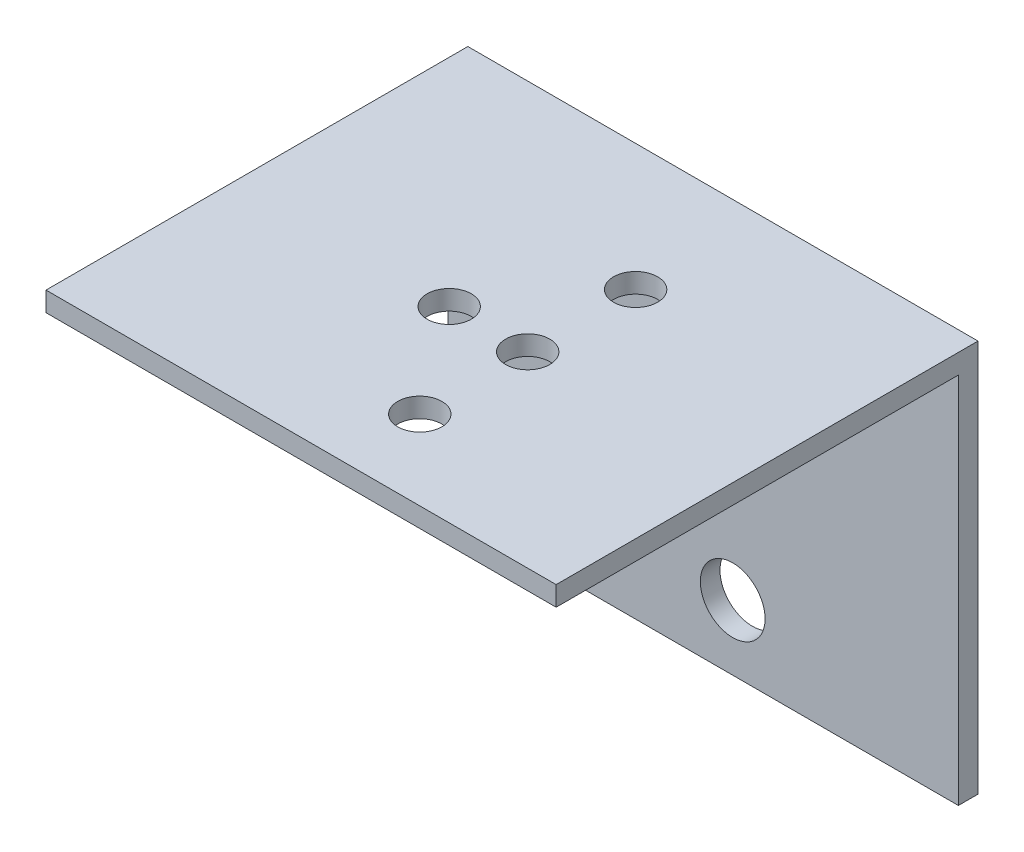
ISO-10303-21;
HEADER;
FILE_DESCRIPTION(('STEP AP214'),'2;1');
FILE_NAME('part.step','',(''),(''),'','','');
FILE_SCHEMA(('AUTOMOTIVE_DESIGN { 1 0 10303 214 1 1 1 1 }'));
ENDSEC;
DATA;
#1=APPLICATION_CONTEXT('core data for automotive mechanical design processes');
#2=APPLICATION_PROTOCOL_DEFINITION('international standard','automotive_design',2000,#1);
#3=PRODUCT_CONTEXT('',#1,'mechanical');
#4=PRODUCT('Part','Part','',(#3));
#5=PRODUCT_RELATED_PRODUCT_CATEGORY('part','',(#4));
#6=PRODUCT_DEFINITION_FORMATION('','',#4);
#7=PRODUCT_DEFINITION_CONTEXT('part definition',#1,'design');
#8=PRODUCT_DEFINITION('design','',#6,#7);
#9=PRODUCT_DEFINITION_SHAPE('','',#8);
#10=(LENGTH_UNIT() NAMED_UNIT(*) SI_UNIT(.MILLI.,.METRE.));
#11=(NAMED_UNIT(*) PLANE_ANGLE_UNIT() SI_UNIT($,.RADIAN.));
#12=(NAMED_UNIT(*) SI_UNIT($,.STERADIAN.) SOLID_ANGLE_UNIT());
#13=UNCERTAINTY_MEASURE_WITH_UNIT(LENGTH_MEASURE(1.E-05),#10,'distance_accuracy_value','');
#14=(GEOMETRIC_REPRESENTATION_CONTEXT(3) GLOBAL_UNCERTAINTY_ASSIGNED_CONTEXT((#13)) GLOBAL_UNIT_ASSIGNED_CONTEXT((#10,
#11,#12)) REPRESENTATION_CONTEXT('',''));
#15=CARTESIAN_POINT('',(0.,0.,0.));
#16=DIRECTION('',(0.,0.,1.));
#17=DIRECTION('',(1.,0.,0.));
#18=AXIS2_PLACEMENT_3D('',#15,#16,#17);
#19=CARTESIAN_POINT('',(0.,0.,0.));
#20=DIRECTION('',(0.,0.,-1.));
#21=DIRECTION('',(-1.,0.,0.));
#22=AXIS2_PLACEMENT_3D('',#19,#20,#21);
#23=PLANE('',#22);
#24=DIRECTION('',(0.,1.,0.));
#25=VECTOR('',#24,1.);
#26=CARTESIAN_POINT('',(26.,-20.,0.));
#27=LINE('',#26,#25);
#28=CARTESIAN_POINT('',(26.,-20.,0.));
#29=VERTEX_POINT('',#28);
#30=CARTESIAN_POINT('',(26.,20.,0.));
#31=VERTEX_POINT('',#30);
#32=EDGE_CURVE('E80',#29,#31,#27,.T.);
#33=ORIENTED_EDGE('',*,*,#32,.F.);
#34=DIRECTION('',(1.,0.,0.));
#35=VECTOR('',#34,1.);
#36=CARTESIAN_POINT('',(-26.,-20.,0.));
#37=LINE('',#36,#35);
#38=CARTESIAN_POINT('',(-26.,-20.,0.));
#39=VERTEX_POINT('',#38);
#40=EDGE_CURVE('E88',#39,#29,#37,.T.);
#41=ORIENTED_EDGE('',*,*,#40,.F.);
#42=DIRECTION('',(0.,-1.,0.));
#43=VECTOR('',#42,1.);
#44=CARTESIAN_POINT('',(-26.,-20.,0.));
#45=LINE('',#44,#43);
#46=CARTESIAN_POINT('',(-26.,20.,0.));
#47=VERTEX_POINT('',#46);
#48=EDGE_CURVE('E93',#47,#39,#45,.T.);
#49=ORIENTED_EDGE('',*,*,#48,.F.);
#50=DIRECTION('',(-1.,0.,0.));
#51=VECTOR('',#50,1.);
#52=CARTESIAN_POINT('',(-26.,20.,0.));
#53=LINE('',#52,#51);
#54=EDGE_CURVE('E96',#31,#47,#53,.T.);
#55=ORIENTED_EDGE('',*,*,#54,.F.);
#56=EDGE_LOOP('',(#33,#41,#49,#55));
#57=FACE_BOUND('',#56,.T.);
#58=CARTESIAN_POINT('',(2.99738775355962,-13.3785391674337,0.));
#59=DIRECTION('',(0.,0.,1.));
#60=DIRECTION('',(1.,0.,0.));
#61=AXIS2_PLACEMENT_3D('',#58,#59,#60);
#62=CIRCLE('',#61,3.3);
#63=CARTESIAN_POINT('',(6.29738775355962,-13.3785391674337,0.));
#64=VERTEX_POINT('',#63);
#65=EDGE_CURVE('E131',#64,#64,#62,.T.);
#66=ORIENTED_EDGE('',*,*,#65,.T.);
#67=EDGE_LOOP('',(#66));
#68=FACE_BOUND('',#67,.T.);
#69=CARTESIAN_POINT('',(-16.4428631453504,-13.3785391674337,0.));
#70=DIRECTION('',(0.,0.,1.));
#71=DIRECTION('',(1.,0.,0.));
#72=AXIS2_PLACEMENT_3D('',#69,#70,#71);
#73=CIRCLE('',#72,3.3);
#74=CARTESIAN_POINT('',(-13.1428631453504,-13.3785391674337,0.));
#75=VERTEX_POINT('',#74);
#76=EDGE_CURVE('E137',#75,#75,#73,.T.);
#77=ORIENTED_EDGE('',*,*,#76,.T.);
#78=EDGE_LOOP('',(#77));
#79=FACE_BOUND('',#78,.T.);
#80=CARTESIAN_POINT('',(-16.4428631453504,9.32052376009551,0.));
#81=DIRECTION('',(0.,0.,1.));
#82=DIRECTION('',(1.,0.,0.));
#83=AXIS2_PLACEMENT_3D('',#80,#81,#82);
#84=CIRCLE('',#83,3.3);
#85=CARTESIAN_POINT('',(-13.1428631453504,9.32052376009551,0.));
#86=VERTEX_POINT('',#85);
#87=EDGE_CURVE('E143',#86,#86,#84,.T.);
#88=ORIENTED_EDGE('',*,*,#87,.T.);
#89=EDGE_LOOP('',(#88));
#90=FACE_BOUND('',#89,.T.);
#91=CARTESIAN_POINT('',(2.99738775355962,9.32052376009551,0.));
#92=DIRECTION('',(0.,0.,1.));
#93=DIRECTION('',(1.,0.,0.));
#94=AXIS2_PLACEMENT_3D('',#91,#92,#93);
#95=CIRCLE('',#94,3.3);
#96=CARTESIAN_POINT('',(6.29738775355962,9.32052376009551,0.));
#97=VERTEX_POINT('',#96);
#98=EDGE_CURVE('E149',#97,#97,#95,.T.);
#99=ORIENTED_EDGE('',*,*,#98,.T.);
#100=EDGE_LOOP('',(#99));
#101=FACE_BOUND('',#100,.T.);
#102=ADVANCED_FACE('F35',(#57,#68,#79,#90,#101),#23,.T.);
#103=CARTESIAN_POINT('',(26.,-20.,43.));
#104=DIRECTION('',(-1.,0.,0.));
#105=DIRECTION('',(0.,0.,1.));
#106=AXIS2_PLACEMENT_3D('',#103,#104,#105);
#107=PLANE('',#106);
#108=DIRECTION('',(0.,1.,0.));
#109=VECTOR('',#108,1.);
#110=CARTESIAN_POINT('',(26.,-20.,43.));
#111=LINE('',#110,#109);
#112=CARTESIAN_POINT('',(26.,18.,43.));
#113=VERTEX_POINT('',#112);
#114=CARTESIAN_POINT('',(26.,20.,43.));
#115=VERTEX_POINT('',#114);
#116=EDGE_CURVE('E92',#113,#115,#111,.T.);
#117=ORIENTED_EDGE('',*,*,#116,.F.);
#118=DIRECTION('',(0.,0.,-1.));
#119=VECTOR('',#118,1.);
#120=CARTESIAN_POINT('',(26.,18.,43.));
#121=LINE('',#120,#119);
#122=CARTESIAN_POINT('',(26.,18.,2.));
#123=VERTEX_POINT('',#122);
#124=EDGE_CURVE('E116',#113,#123,#121,.T.);
#125=ORIENTED_EDGE('',*,*,#124,.T.);
#126=DIRECTION('',(0.,-1.,0.));
#127=VECTOR('',#126,1.);
#128=CARTESIAN_POINT('',(26.,-20.,2.));
#129=LINE('',#128,#127);
#130=CARTESIAN_POINT('',(26.,-20.,2.));
#131=VERTEX_POINT('',#130);
#132=EDGE_CURVE('E84',#123,#131,#129,.T.);
#133=ORIENTED_EDGE('',*,*,#132,.T.);
#134=DIRECTION('',(0.,0.,-1.));
#135=VECTOR('',#134,1.);
#136=CARTESIAN_POINT('',(26.,-20.,43.));
#137=LINE('',#136,#135);
#138=EDGE_CURVE('E76',#131,#29,#137,.T.);
#139=ORIENTED_EDGE('',*,*,#138,.T.);
#140=ORIENTED_EDGE('',*,*,#32,.T.);
#141=DIRECTION('',(0.,0.,-1.));
#142=VECTOR('',#141,1.);
#143=CARTESIAN_POINT('',(26.,20.,43.));
#144=LINE('',#143,#142);
#145=EDGE_CURVE('E44',#115,#31,#144,.T.);
#146=ORIENTED_EDGE('',*,*,#145,.F.);
#147=EDGE_LOOP('',(#117,#125,#133,#139,#140,#146));
#148=FACE_BOUND('',#147,.T.);
#149=ADVANCED_FACE('F37',(#148),#107,.F.);
#150=CARTESIAN_POINT('',(-26.,20.,43.));
#151=DIRECTION('',(0.,-1.,0.));
#152=DIRECTION('',(0.,0.,-1.));
#153=AXIS2_PLACEMENT_3D('',#150,#151,#152);
#154=PLANE('',#153);
#155=CARTESIAN_POINT('',(4.00000000000711,20.,34.8999999998098));
#156=DIRECTION('',(0.,-1.,0.));
#157=DIRECTION('',(0.,0.,-1.));
#158=AXIS2_PLACEMENT_3D('',#155,#156,#157);
#159=CIRCLE('',#158,2.25);
#160=CARTESIAN_POINT('',(4.00000000000711,20.,32.6499999998098));
#161=VERTEX_POINT('',#160);
#162=EDGE_CURVE('E173',#161,#161,#159,.T.);
#163=ORIENTED_EDGE('',*,*,#162,.T.);
#164=EDGE_LOOP('',(#163));
#165=FACE_BOUND('',#164,.T.);
#166=CARTESIAN_POINT('',(4.00000000000711,20.,23.8999999998099));
#167=DIRECTION('',(0.,-1.,0.));
#168=DIRECTION('',(0.,0.,-1.));
#169=AXIS2_PLACEMENT_3D('',#166,#167,#168);
#170=CIRCLE('',#169,2.25);
#171=CARTESIAN_POINT('',(4.00000000000711,20.,21.6499999998099));
#172=VERTEX_POINT('',#171);
#173=EDGE_CURVE('E167',#172,#172,#170,.T.);
#174=ORIENTED_EDGE('',*,*,#173,.T.);
#175=EDGE_LOOP('',(#174));
#176=FACE_BOUND('',#175,.T.);
#177=CARTESIAN_POINT('',(4.00000000000711,20.,12.8999999998098));
#178=DIRECTION('',(0.,-1.,0.));
#179=DIRECTION('',(0.,0.,-1.));
#180=AXIS2_PLACEMENT_3D('',#177,#178,#179);
#181=CIRCLE('',#180,2.25);
#182=CARTESIAN_POINT('',(4.00000000000711,20.,10.6499999998098));
#183=VERTEX_POINT('',#182);
#184=EDGE_CURVE('E161',#183,#183,#181,.T.);
#185=ORIENTED_EDGE('',*,*,#184,.T.);
#186=EDGE_LOOP('',(#185));
#187=FACE_BOUND('',#186,.T.);
#188=CARTESIAN_POINT('',(-3.9999999999929,20.,23.8999999998099));
#189=DIRECTION('',(0.,-1.,0.));
#190=DIRECTION('',(0.,0.,-1.));
#191=AXIS2_PLACEMENT_3D('',#188,#189,#190);
#192=CIRCLE('',#191,2.25);
#193=CARTESIAN_POINT('',(-3.9999999999929,20.,21.6499999998099));
#194=VERTEX_POINT('',#193);
#195=EDGE_CURVE('E155',#194,#194,#192,.T.);
#196=ORIENTED_EDGE('',*,*,#195,.T.);
#197=EDGE_LOOP('',(#196));
#198=FACE_BOUND('',#197,.T.);
#199=ORIENTED_EDGE('',*,*,#54,.T.);
#200=DIRECTION('',(0.,0.,-1.));
#201=VECTOR('',#200,1.);
#202=CARTESIAN_POINT('',(-26.,20.,43.));
#203=LINE('',#202,#201);
#204=CARTESIAN_POINT('',(-26.,20.,43.));
#205=VERTEX_POINT('',#204);
#206=EDGE_CURVE('E109',#205,#47,#203,.T.);
#207=ORIENTED_EDGE('',*,*,#206,.F.);
#208=DIRECTION('',(-1.,0.,0.));
#209=VECTOR('',#208,1.);
#210=CARTESIAN_POINT('',(-26.,20.,43.));
#211=LINE('',#210,#209);
#212=EDGE_CURVE('E52',#115,#205,#211,.T.);
#213=ORIENTED_EDGE('',*,*,#212,.F.);
#214=ORIENTED_EDGE('',*,*,#145,.T.);
#215=EDGE_LOOP('',(#199,#207,#213,#214));
#216=FACE_BOUND('',#215,.T.);
#217=ADVANCED_FACE('F112',(#165,#176,#187,#198,#216),#154,.F.);
#218=CARTESIAN_POINT('',(-26.,-20.,43.));
#219=DIRECTION('',(1.,0.,0.));
#220=DIRECTION('',(0.,0.,-1.));
#221=AXIS2_PLACEMENT_3D('',#218,#219,#220);
#222=PLANE('',#221);
#223=DIRECTION('',(0.,0.,-1.));
#224=VECTOR('',#223,1.);
#225=CARTESIAN_POINT('',(-26.,-20.,43.));
#226=LINE('',#225,#224);
#227=CARTESIAN_POINT('',(-26.,-20.,2.));
#228=VERTEX_POINT('',#227);
#229=EDGE_CURVE('E69',#228,#39,#226,.T.);
#230=ORIENTED_EDGE('',*,*,#229,.F.);
#231=DIRECTION('',(0.,-1.,0.));
#232=VECTOR('',#231,1.);
#233=CARTESIAN_POINT('',(-26.,18.,2.));
#234=LINE('',#233,#232);
#235=CARTESIAN_POINT('',(-26.,18.,2.));
#236=VERTEX_POINT('',#235);
#237=EDGE_CURVE('E123',#236,#228,#234,.T.);
#238=ORIENTED_EDGE('',*,*,#237,.F.);
#239=DIRECTION('',(0.,0.,-1.));
#240=VECTOR('',#239,1.);
#241=CARTESIAN_POINT('',(-26.,18.,50.2220480122162));
#242=LINE('',#241,#240);
#243=CARTESIAN_POINT('',(-26.,18.,43.));
#244=VERTEX_POINT('',#243);
#245=EDGE_CURVE('E102',#244,#236,#242,.T.);
#246=ORIENTED_EDGE('',*,*,#245,.F.);
#247=DIRECTION('',(0.,-1.,0.));
#248=VECTOR('',#247,1.);
#249=CARTESIAN_POINT('',(-26.,-20.,43.));
#250=LINE('',#249,#248);
#251=EDGE_CURVE('E85',#205,#244,#250,.T.);
#252=ORIENTED_EDGE('',*,*,#251,.F.);
#253=ORIENTED_EDGE('',*,*,#206,.T.);
#254=ORIENTED_EDGE('',*,*,#48,.T.);
#255=EDGE_LOOP('',(#230,#238,#246,#252,#253,#254));
#256=FACE_BOUND('',#255,.T.);
#257=ADVANCED_FACE('F203',(#256),#222,.F.);
#258=CARTESIAN_POINT('',(-26.,-20.,43.));
#259=DIRECTION('',(0.,1.,0.));
#260=DIRECTION('',(0.,0.,1.));
#261=AXIS2_PLACEMENT_3D('',#258,#259,#260);
#262=PLANE('',#261);
#263=ORIENTED_EDGE('',*,*,#138,.F.);
#264=DIRECTION('',(1.,0.,0.));
#265=VECTOR('',#264,1.);
#266=CARTESIAN_POINT('',(-34.6851779686972,-20.,2.));
#267=LINE('',#266,#265);
#268=EDGE_CURVE('E128',#228,#131,#267,.T.);
#269=ORIENTED_EDGE('',*,*,#268,.F.);
#270=ORIENTED_EDGE('',*,*,#229,.T.);
#271=ORIENTED_EDGE('',*,*,#40,.T.);
#272=EDGE_LOOP('',(#263,#269,#270,#271));
#273=FACE_BOUND('',#272,.T.);
#274=ADVANCED_FACE('F89',(#273),#262,.F.);
#275=CARTESIAN_POINT('',(0.,0.,43.));
#276=DIRECTION('',(0.,0.,-1.));
#277=DIRECTION('',(-1.,0.,0.));
#278=AXIS2_PLACEMENT_3D('',#275,#276,#277);
#279=PLANE('',#278);
#280=DIRECTION('',(1.,0.,0.));
#281=VECTOR('',#280,1.);
#282=CARTESIAN_POINT('',(0.,18.,43.));
#283=LINE('',#282,#281);
#284=EDGE_CURVE('E11',#244,#113,#283,.T.);
#285=ORIENTED_EDGE('',*,*,#284,.T.);
#286=ORIENTED_EDGE('',*,*,#116,.T.);
#287=ORIENTED_EDGE('',*,*,#212,.T.);
#288=ORIENTED_EDGE('',*,*,#251,.T.);
#289=EDGE_LOOP('',(#285,#286,#287,#288));
#290=FACE_BOUND('',#289,.T.);
#291=ADVANCED_FACE('F186',(#290),#279,.F.);
#292=CARTESIAN_POINT('',(24.,18.,50.2220480122162));
#293=DIRECTION('',(0.,1.,0.));
#294=DIRECTION('',(0.,0.,1.));
#295=AXIS2_PLACEMENT_3D('',#292,#293,#294);
#296=PLANE('',#295);
#297=CARTESIAN_POINT('',(4.00000000000711,18.,34.8999999998098));
#298=DIRECTION('',(0.,-1.,0.));
#299=DIRECTION('',(0.,0.,-1.));
#300=AXIS2_PLACEMENT_3D('',#297,#298,#299);
#301=CIRCLE('',#300,2.25);
#302=CARTESIAN_POINT('',(4.00000000000711,18.,32.6499999998098));
#303=VERTEX_POINT('',#302);
#304=EDGE_CURVE('E176',#303,#303,#301,.T.);
#305=ORIENTED_EDGE('',*,*,#304,.F.);
#306=EDGE_LOOP('',(#305));
#307=FACE_BOUND('',#306,.T.);
#308=CARTESIAN_POINT('',(4.00000000000711,18.,23.8999999998099));
#309=DIRECTION('',(0.,-1.,0.));
#310=DIRECTION('',(0.,0.,-1.));
#311=AXIS2_PLACEMENT_3D('',#308,#309,#310);
#312=CIRCLE('',#311,2.25);
#313=CARTESIAN_POINT('',(4.00000000000711,18.,21.6499999998099));
#314=VERTEX_POINT('',#313);
#315=EDGE_CURVE('E170',#314,#314,#312,.T.);
#316=ORIENTED_EDGE('',*,*,#315,.F.);
#317=EDGE_LOOP('',(#316));
#318=FACE_BOUND('',#317,.T.);
#319=CARTESIAN_POINT('',(4.00000000000711,18.,12.8999999998098));
#320=DIRECTION('',(0.,-1.,0.));
#321=DIRECTION('',(0.,0.,-1.));
#322=AXIS2_PLACEMENT_3D('',#319,#320,#321);
#323=CIRCLE('',#322,2.25);
#324=CARTESIAN_POINT('',(4.00000000000711,18.,10.6499999998098));
#325=VERTEX_POINT('',#324);
#326=EDGE_CURVE('E164',#325,#325,#323,.T.);
#327=ORIENTED_EDGE('',*,*,#326,.F.);
#328=EDGE_LOOP('',(#327));
#329=FACE_BOUND('',#328,.T.);
#330=CARTESIAN_POINT('',(-3.9999999999929,18.,23.8999999998099));
#331=DIRECTION('',(0.,-1.,0.));
#332=DIRECTION('',(0.,0.,-1.));
#333=AXIS2_PLACEMENT_3D('',#330,#331,#332);
#334=CIRCLE('',#333,2.25);
#335=CARTESIAN_POINT('',(-3.9999999999929,18.,21.6499999998099));
#336=VERTEX_POINT('',#335);
#337=EDGE_CURVE('E158',#336,#336,#334,.T.);
#338=ORIENTED_EDGE('',*,*,#337,.F.);
#339=EDGE_LOOP('',(#338));
#340=FACE_BOUND('',#339,.T.);
#341=ORIENTED_EDGE('',*,*,#245,.T.);
#342=DIRECTION('',(-1.,0.,0.));
#343=VECTOR('',#342,1.);
#344=CARTESIAN_POINT('',(24.,18.,2.));
#345=LINE('',#344,#343);
#346=EDGE_CURVE('E98',#123,#236,#345,.T.);
#347=ORIENTED_EDGE('',*,*,#346,.F.);
#348=ORIENTED_EDGE('',*,*,#124,.F.);
#349=ORIENTED_EDGE('',*,*,#284,.F.);
#350=EDGE_LOOP('',(#341,#347,#348,#349));
#351=FACE_BOUND('',#350,.T.);
#352=ADVANCED_FACE('F182',(#307,#318,#329,#340,#351),#296,.F.);
#353=CARTESIAN_POINT('',(24.,18.,2.));
#354=DIRECTION('',(0.,0.,-1.));
#355=DIRECTION('',(-1.,0.,0.));
#356=AXIS2_PLACEMENT_3D('',#353,#354,#355);
#357=PLANE('',#356);
#358=CARTESIAN_POINT('',(2.99738775355962,9.32052376009551,2.));
#359=DIRECTION('',(0.,0.,1.));
#360=DIRECTION('',(1.,0.,0.));
#361=AXIS2_PLACEMENT_3D('',#358,#359,#360);
#362=CIRCLE('',#361,3.29999999999999);
#363=CARTESIAN_POINT('',(6.29738775355961,9.32052376009551,2.));
#364=VERTEX_POINT('',#363);
#365=EDGE_CURVE('E152',#364,#364,#362,.T.);
#366=ORIENTED_EDGE('',*,*,#365,.F.);
#367=EDGE_LOOP('',(#366));
#368=FACE_BOUND('',#367,.T.);
#369=CARTESIAN_POINT('',(-16.4428631453504,9.32052376009551,2.));
#370=DIRECTION('',(0.,0.,1.));
#371=DIRECTION('',(1.,0.,0.));
#372=AXIS2_PLACEMENT_3D('',#369,#370,#371);
#373=CIRCLE('',#372,3.29999999999999);
#374=CARTESIAN_POINT('',(-13.1428631453504,9.32052376009551,2.));
#375=VERTEX_POINT('',#374);
#376=EDGE_CURVE('E146',#375,#375,#373,.T.);
#377=ORIENTED_EDGE('',*,*,#376,.F.);
#378=EDGE_LOOP('',(#377));
#379=FACE_BOUND('',#378,.T.);
#380=CARTESIAN_POINT('',(-16.4428631453504,-13.3785391674337,2.));
#381=DIRECTION('',(0.,0.,1.));
#382=DIRECTION('',(1.,0.,0.));
#383=AXIS2_PLACEMENT_3D('',#380,#381,#382);
#384=CIRCLE('',#383,3.29999999999999);
#385=CARTESIAN_POINT('',(-13.1428631453504,-13.3785391674337,2.));
#386=VERTEX_POINT('',#385);
#387=EDGE_CURVE('E140',#386,#386,#384,.T.);
#388=ORIENTED_EDGE('',*,*,#387,.F.);
#389=EDGE_LOOP('',(#388));
#390=FACE_BOUND('',#389,.T.);
#391=CARTESIAN_POINT('',(2.99738775355962,-13.3785391674337,2.));
#392=DIRECTION('',(0.,0.,1.));
#393=DIRECTION('',(1.,0.,0.));
#394=AXIS2_PLACEMENT_3D('',#391,#392,#393);
#395=CIRCLE('',#394,3.29999999999999);
#396=CARTESIAN_POINT('',(6.29738775355961,-13.3785391674337,2.));
#397=VERTEX_POINT('',#396);
#398=EDGE_CURVE('E134',#397,#397,#395,.T.);
#399=ORIENTED_EDGE('',*,*,#398,.F.);
#400=EDGE_LOOP('',(#399));
#401=FACE_BOUND('',#400,.T.);
#402=ORIENTED_EDGE('',*,*,#237,.T.);
#403=ORIENTED_EDGE('',*,*,#268,.T.);
#404=ORIENTED_EDGE('',*,*,#132,.F.);
#405=ORIENTED_EDGE('',*,*,#346,.T.);
#406=EDGE_LOOP('',(#402,#403,#404,#405));
#407=FACE_BOUND('',#406,.T.);
#408=ADVANCED_FACE('F185',(#368,#379,#390,#401,#407),#357,.F.);
#409=CARTESIAN_POINT('',(2.99738775355962,-13.3785391674337,2.));
#410=DIRECTION('',(0.,0.,1.));
#411=DIRECTION('',(1.,0.,0.));
#412=AXIS2_PLACEMENT_3D('',#409,#410,#411);
#413=CYLINDRICAL_SURFACE('',#412,3.29999999999999);
#414=ORIENTED_EDGE('',*,*,#65,.F.);
#415=EDGE_LOOP('',(#414));
#416=FACE_BOUND('',#415,.T.);
#417=ORIENTED_EDGE('',*,*,#398,.T.);
#418=EDGE_LOOP('',(#417));
#419=FACE_BOUND('',#418,.T.);
#420=ADVANCED_FACE('F260',(#416,#419),#413,.F.);
#421=CARTESIAN_POINT('',(-16.4428631453504,-13.3785391674337,2.));
#422=DIRECTION('',(0.,0.,1.));
#423=DIRECTION('',(1.,0.,0.));
#424=AXIS2_PLACEMENT_3D('',#421,#422,#423);
#425=CYLINDRICAL_SURFACE('',#424,3.29999999999999);
#426=ORIENTED_EDGE('',*,*,#76,.F.);
#427=EDGE_LOOP('',(#426));
#428=FACE_BOUND('',#427,.T.);
#429=ORIENTED_EDGE('',*,*,#387,.T.);
#430=EDGE_LOOP('',(#429));
#431=FACE_BOUND('',#430,.T.);
#432=ADVANCED_FACE('F256',(#428,#431),#425,.F.);
#433=CARTESIAN_POINT('',(-16.4428631453504,9.32052376009551,2.));
#434=DIRECTION('',(0.,0.,1.));
#435=DIRECTION('',(1.,0.,0.));
#436=AXIS2_PLACEMENT_3D('',#433,#434,#435);
#437=CYLINDRICAL_SURFACE('',#436,3.29999999999999);
#438=ORIENTED_EDGE('',*,*,#87,.F.);
#439=EDGE_LOOP('',(#438));
#440=FACE_BOUND('',#439,.T.);
#441=ORIENTED_EDGE('',*,*,#376,.T.);
#442=EDGE_LOOP('',(#441));
#443=FACE_BOUND('',#442,.T.);
#444=ADVANCED_FACE('F249',(#440,#443),#437,.F.);
#445=CARTESIAN_POINT('',(2.99738775355962,9.32052376009551,2.));
#446=DIRECTION('',(0.,0.,1.));
#447=DIRECTION('',(1.,0.,0.));
#448=AXIS2_PLACEMENT_3D('',#445,#446,#447);
#449=CYLINDRICAL_SURFACE('',#448,3.29999999999999);
#450=ORIENTED_EDGE('',*,*,#98,.F.);
#451=EDGE_LOOP('',(#450));
#452=FACE_BOUND('',#451,.T.);
#453=ORIENTED_EDGE('',*,*,#365,.T.);
#454=EDGE_LOOP('',(#453));
#455=FACE_BOUND('',#454,.T.);
#456=ADVANCED_FACE('F240',(#452,#455),#449,.F.);
#457=CARTESIAN_POINT('',(-3.9999999999929,18.,23.8999999998099));
#458=DIRECTION('',(0.,-1.,0.));
#459=DIRECTION('',(0.,0.,-1.));
#460=AXIS2_PLACEMENT_3D('',#457,#458,#459);
#461=CYLINDRICAL_SURFACE('',#460,2.25);
#462=ORIENTED_EDGE('',*,*,#195,.F.);
#463=EDGE_LOOP('',(#462));
#464=FACE_BOUND('',#463,.T.);
#465=ORIENTED_EDGE('',*,*,#337,.T.);
#466=EDGE_LOOP('',(#465));
#467=FACE_BOUND('',#466,.T.);
#468=ADVANCED_FACE('F236',(#464,#467),#461,.F.);
#469=CARTESIAN_POINT('',(4.00000000000711,18.,12.8999999998098));
#470=DIRECTION('',(0.,-1.,0.));
#471=DIRECTION('',(0.,0.,-1.));
#472=AXIS2_PLACEMENT_3D('',#469,#470,#471);
#473=CYLINDRICAL_SURFACE('',#472,2.25);
#474=ORIENTED_EDGE('',*,*,#184,.F.);
#475=EDGE_LOOP('',(#474));
#476=FACE_BOUND('',#475,.T.);
#477=ORIENTED_EDGE('',*,*,#326,.T.);
#478=EDGE_LOOP('',(#477));
#479=FACE_BOUND('',#478,.T.);
#480=ADVANCED_FACE('F239',(#476,#479),#473,.F.);
#481=CARTESIAN_POINT('',(4.00000000000711,18.,23.8999999998099));
#482=DIRECTION('',(0.,-1.,0.));
#483=DIRECTION('',(0.,0.,-1.));
#484=AXIS2_PLACEMENT_3D('',#481,#482,#483);
#485=CYLINDRICAL_SURFACE('',#484,2.25);
#486=ORIENTED_EDGE('',*,*,#173,.F.);
#487=EDGE_LOOP('',(#486));
#488=FACE_BOUND('',#487,.T.);
#489=ORIENTED_EDGE('',*,*,#315,.T.);
#490=EDGE_LOOP('',(#489));
#491=FACE_BOUND('',#490,.T.);
#492=ADVANCED_FACE('F246',(#488,#491),#485,.F.);
#493=CARTESIAN_POINT('',(4.00000000000711,18.,34.8999999998098));
#494=DIRECTION('',(0.,-1.,0.));
#495=DIRECTION('',(0.,0.,-1.));
#496=AXIS2_PLACEMENT_3D('',#493,#494,#495);
#497=CYLINDRICAL_SURFACE('',#496,2.25);
#498=ORIENTED_EDGE('',*,*,#162,.F.);
#499=EDGE_LOOP('',(#498));
#500=FACE_BOUND('',#499,.T.);
#501=ORIENTED_EDGE('',*,*,#304,.T.);
#502=EDGE_LOOP('',(#501));
#503=FACE_BOUND('',#502,.T.);
#504=ADVANCED_FACE('F180',(#500,#503),#497,.F.);
#505=CLOSED_SHELL('',(#102,#149,#217,#257,#274,#291,#352,#408,#420,#432,#444,#456,#468,#480,
#492,#504));
#506=MANIFOLD_SOLID_BREP('B2',#505);
#507=ADVANCED_BREP_SHAPE_REPRESENTATION('',(#18,#506),#14);
#508=SHAPE_DEFINITION_REPRESENTATION(#9,#507);
ENDSEC;
END-ISO-10303-21;
